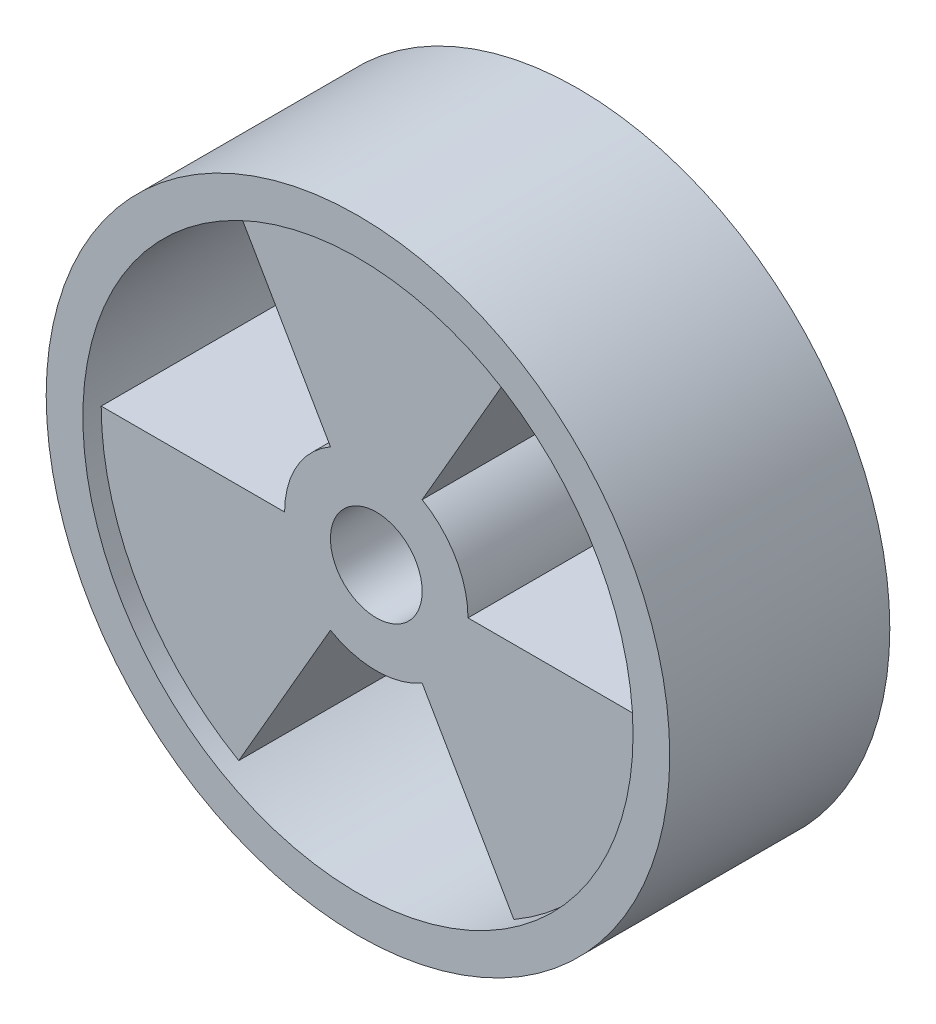
ISO-10303-21;
HEADER;
FILE_DESCRIPTION(('STEP AP214'),'2;1');
FILE_NAME('part.step','',(''),(''),'','','');
FILE_SCHEMA(('AUTOMOTIVE_DESIGN { 1 0 10303 214 1 1 1 1 }'));
ENDSEC;
DATA;
#1=APPLICATION_CONTEXT('core data for automotive mechanical design processes');
#2=APPLICATION_PROTOCOL_DEFINITION('international standard','automotive_design',2000,#1);
#3=PRODUCT_CONTEXT('',#1,'mechanical');
#4=PRODUCT('Part','Part','',(#3));
#5=PRODUCT_RELATED_PRODUCT_CATEGORY('part','',(#4));
#6=PRODUCT_DEFINITION_FORMATION('','',#4);
#7=PRODUCT_DEFINITION_CONTEXT('part definition',#1,'design');
#8=PRODUCT_DEFINITION('design','',#6,#7);
#9=PRODUCT_DEFINITION_SHAPE('','',#8);
#10=(LENGTH_UNIT() NAMED_UNIT(*) SI_UNIT(.MILLI.,.METRE.));
#11=(NAMED_UNIT(*) PLANE_ANGLE_UNIT() SI_UNIT($,.RADIAN.));
#12=(NAMED_UNIT(*) SI_UNIT($,.STERADIAN.) SOLID_ANGLE_UNIT());
#13=UNCERTAINTY_MEASURE_WITH_UNIT(LENGTH_MEASURE(1.E-05),#10,'distance_accuracy_value','');
#14=(GEOMETRIC_REPRESENTATION_CONTEXT(3) GLOBAL_UNCERTAINTY_ASSIGNED_CONTEXT((#13)) GLOBAL_UNIT_ASSIGNED_CONTEXT((#10,
#11,#12)) REPRESENTATION_CONTEXT('',''));
#15=CARTESIAN_POINT('',(0.,0.,0.));
#16=DIRECTION('',(0.,0.,1.));
#17=DIRECTION('',(1.,0.,0.));
#18=AXIS2_PLACEMENT_3D('',#15,#16,#17);
#19=CARTESIAN_POINT('',(0.,0.,10.));
#20=DIRECTION('',(0.,0.,1.));
#21=DIRECTION('',(1.,0.,0.));
#22=AXIS2_PLACEMENT_3D('',#19,#20,#21);
#23=PLANE('',#22);
#24=CARTESIAN_POINT('',(0.,0.,10.));
#25=DIRECTION('',(0.,0.,1.));
#26=DIRECTION('',(1.,0.,0.));
#27=AXIS2_PLACEMENT_3D('',#24,#25,#26);
#28=CIRCLE('',#27,2.5);
#29=CARTESIAN_POINT('',(2.5,0.,10.));
#30=VERTEX_POINT('',#29);
#31=EDGE_CURVE('E393',#30,#30,#28,.T.);
#32=ORIENTED_EDGE('',*,*,#31,.F.);
#33=EDGE_LOOP('',(#32));
#34=FACE_BOUND('',#33,.T.);
#35=DIRECTION('',(0.5,0.866025403784439,0.));
#36=VECTOR('',#35,1.);
#37=CARTESIAN_POINT('',(0.,0.,10.));
#38=LINE('',#37,#36);
#39=CARTESIAN_POINT('',(2.5,4.33012701892219,10.));
#40=VERTEX_POINT('',#39);
#41=CARTESIAN_POINT('',(7.5,12.9903810567666,10.));
#42=VERTEX_POINT('',#41);
#43=EDGE_CURVE('E11',#40,#42,#38,.T.);
#44=ORIENTED_EDGE('',*,*,#43,.T.);
#45=CARTESIAN_POINT('',(0.,0.,10.));
#46=DIRECTION('',(0.,0.,1.));
#47=DIRECTION('',(1.,0.,0.));
#48=AXIS2_PLACEMENT_3D('',#45,#46,#47);
#49=CIRCLE('',#48,15.);
#50=CARTESIAN_POINT('',(-7.50000000000003,12.9903810567666,10.));
#51=VERTEX_POINT('',#50);
#52=EDGE_CURVE('E146',#42,#51,#49,.T.);
#53=ORIENTED_EDGE('',*,*,#52,.T.);
#54=DIRECTION('',(-0.500000000000002,0.866025403784437,0.));
#55=VECTOR('',#54,1.);
#56=CARTESIAN_POINT('',(0.,0.,10.));
#57=LINE('',#56,#55);
#58=CARTESIAN_POINT('',(-2.50000000000001,4.33012701892219,10.));
#59=VERTEX_POINT('',#58);
#60=EDGE_CURVE('E221',#59,#51,#57,.T.);
#61=ORIENTED_EDGE('',*,*,#60,.F.);
#62=CARTESIAN_POINT('',(0.,0.,10.));
#63=DIRECTION('',(0.,0.,1.));
#64=DIRECTION('',(1.,0.,0.));
#65=AXIS2_PLACEMENT_3D('',#62,#63,#64);
#66=CIRCLE('',#65,5.);
#67=CARTESIAN_POINT('',(-5.,0.,10.));
#68=VERTEX_POINT('',#67);
#69=EDGE_CURVE('E158',#59,#68,#66,.T.);
#70=ORIENTED_EDGE('',*,*,#69,.T.);
#71=DIRECTION('',(-1.,0.,0.));
#72=VECTOR('',#71,1.);
#73=CARTESIAN_POINT('',(0.,0.,10.));
#74=LINE('',#73,#72);
#75=CARTESIAN_POINT('',(-15.,0.,10.));
#76=VERTEX_POINT('',#75);
#77=EDGE_CURVE('E150',#68,#76,#74,.T.);
#78=ORIENTED_EDGE('',*,*,#77,.T.);
#79=CARTESIAN_POINT('',(-7.49999999999996,-12.9903810567666,10.));
#80=VERTEX_POINT('',#79);
#81=EDGE_CURVE('E131',#76,#80,#49,.T.);
#82=ORIENTED_EDGE('',*,*,#81,.T.);
#83=DIRECTION('',(-0.499999999999998,-0.86602540378444,0.));
#84=VECTOR('',#83,1.);
#85=CARTESIAN_POINT('',(0.,0.,10.));
#86=LINE('',#85,#84);
#87=CARTESIAN_POINT('',(-2.49999999999999,-4.3301270189222,10.));
#88=VERTEX_POINT('',#87);
#89=EDGE_CURVE('E159',#88,#80,#86,.T.);
#90=ORIENTED_EDGE('',*,*,#89,.F.);
#91=CARTESIAN_POINT('',(0.,0.,10.));
#92=DIRECTION('',(0.,0.,1.));
#93=DIRECTION('',(1.,0.,0.));
#94=AXIS2_PLACEMENT_3D('',#91,#92,#93);
#95=CIRCLE('',#94,5.);
#96=CARTESIAN_POINT('',(2.5,-4.33012701892219,10.));
#97=VERTEX_POINT('',#96);
#98=EDGE_CURVE('E162',#88,#97,#95,.T.);
#99=ORIENTED_EDGE('',*,*,#98,.T.);
#100=DIRECTION('',(0.5,-0.866025403784438,0.));
#101=VECTOR('',#100,1.);
#102=CARTESIAN_POINT('',(0.,0.,10.));
#103=LINE('',#102,#101);
#104=CARTESIAN_POINT('',(7.50000000000001,-12.9903810567666,10.));
#105=VERTEX_POINT('',#104);
#106=EDGE_CURVE('E171',#97,#105,#103,.T.);
#107=ORIENTED_EDGE('',*,*,#106,.T.);
#108=CARTESIAN_POINT('',(15.,0.,10.));
#109=VERTEX_POINT('',#108);
#110=EDGE_CURVE('E147',#105,#109,#49,.T.);
#111=ORIENTED_EDGE('',*,*,#110,.T.);
#112=DIRECTION('',(1.,0.,0.));
#113=VECTOR('',#112,1.);
#114=CARTESIAN_POINT('',(0.,0.,10.));
#115=LINE('',#114,#113);
#116=CARTESIAN_POINT('',(5.,0.,10.));
#117=VERTEX_POINT('',#116);
#118=EDGE_CURVE('E167',#117,#109,#115,.T.);
#119=ORIENTED_EDGE('',*,*,#118,.F.);
#120=CARTESIAN_POINT('',(0.,0.,10.));
#121=DIRECTION('',(0.,0.,1.));
#122=DIRECTION('',(1.,0.,0.));
#123=AXIS2_PLACEMENT_3D('',#120,#121,#122);
#124=CIRCLE('',#123,5.);
#125=EDGE_CURVE('E170',#117,#40,#124,.T.);
#126=ORIENTED_EDGE('',*,*,#125,.T.);
#127=EDGE_LOOP('',(#44,#53,#61,#70,#78,#82,#90,#99,#107,#111,#119,#126));
#128=FACE_BOUND('',#127,.T.);
#129=ADVANCED_FACE('F40',(#34,#128),#23,.T.);
#130=CARTESIAN_POINT('',(0.,0.,0.));
#131=DIRECTION('',(0.,0.,1.));
#132=DIRECTION('',(1.,0.,0.));
#133=AXIS2_PLACEMENT_3D('',#130,#131,#132);
#134=PLANE('',#133);
#135=CARTESIAN_POINT('',(0.,0.,0.));
#136=DIRECTION('',(0.,0.,1.));
#137=DIRECTION('',(1.,0.,0.));
#138=AXIS2_PLACEMENT_3D('',#135,#136,#137);
#139=CIRCLE('',#138,2.5);
#140=CARTESIAN_POINT('',(2.5,0.,0.));
#141=VERTEX_POINT('',#140);
#142=EDGE_CURVE('E396',#141,#141,#139,.T.);
#143=ORIENTED_EDGE('',*,*,#142,.T.);
#144=EDGE_LOOP('',(#143));
#145=FACE_BOUND('',#144,.T.);
#146=CARTESIAN_POINT('',(0.,0.,0.));
#147=DIRECTION('',(0.,0.,1.));
#148=DIRECTION('',(1.,0.,0.));
#149=AXIS2_PLACEMENT_3D('',#146,#147,#148);
#150=CIRCLE('',#149,15.);
#151=CARTESIAN_POINT('',(7.5,12.9903810567666,0.));
#152=VERTEX_POINT('',#151);
#153=CARTESIAN_POINT('',(-7.50000000000003,12.9903810567666,0.));
#154=VERTEX_POINT('',#153);
#155=EDGE_CURVE('E205',#152,#154,#150,.T.);
#156=ORIENTED_EDGE('',*,*,#155,.F.);
#157=DIRECTION('',(0.5,0.866025403784439,0.));
#158=VECTOR('',#157,1.);
#159=CARTESIAN_POINT('',(0.,0.,0.));
#160=LINE('',#159,#158);
#161=CARTESIAN_POINT('',(2.5,4.33012701892219,0.));
#162=VERTEX_POINT('',#161);
#163=EDGE_CURVE('E178',#162,#152,#160,.T.);
#164=ORIENTED_EDGE('',*,*,#163,.F.);
#165=CARTESIAN_POINT('',(0.,0.,0.));
#166=DIRECTION('',(0.,0.,1.));
#167=DIRECTION('',(1.,0.,0.));
#168=AXIS2_PLACEMENT_3D('',#165,#166,#167);
#169=CIRCLE('',#168,5.);
#170=CARTESIAN_POINT('',(5.,0.,0.));
#171=VERTEX_POINT('',#170);
#172=EDGE_CURVE('E174',#171,#162,#169,.T.);
#173=ORIENTED_EDGE('',*,*,#172,.F.);
#174=DIRECTION('',(1.,0.,0.));
#175=VECTOR('',#174,1.);
#176=CARTESIAN_POINT('',(0.,0.,0.));
#177=LINE('',#176,#175);
#178=CARTESIAN_POINT('',(15.,0.,0.));
#179=VERTEX_POINT('',#178);
#180=EDGE_CURVE('E176',#171,#179,#177,.T.);
#181=ORIENTED_EDGE('',*,*,#180,.T.);
#182=CARTESIAN_POINT('',(7.5,-12.9903810567666,0.));
#183=VERTEX_POINT('',#182);
#184=EDGE_CURVE('E143',#183,#179,#150,.T.);
#185=ORIENTED_EDGE('',*,*,#184,.F.);
#186=DIRECTION('',(0.5,-0.866025403784438,0.));
#187=VECTOR('',#186,1.);
#188=CARTESIAN_POINT('',(0.,0.,0.));
#189=LINE('',#188,#187);
#190=CARTESIAN_POINT('',(2.5,-4.33012701892219,0.));
#191=VERTEX_POINT('',#190);
#192=EDGE_CURVE('E231',#191,#183,#189,.T.);
#193=ORIENTED_EDGE('',*,*,#192,.F.);
#194=CARTESIAN_POINT('',(0.,0.,0.));
#195=DIRECTION('',(0.,0.,1.));
#196=DIRECTION('',(1.,0.,0.));
#197=AXIS2_PLACEMENT_3D('',#194,#195,#196);
#198=CIRCLE('',#197,5.);
#199=CARTESIAN_POINT('',(-2.49999999999999,-4.3301270189222,0.));
#200=VERTEX_POINT('',#199);
#201=EDGE_CURVE('E63',#200,#191,#198,.T.);
#202=ORIENTED_EDGE('',*,*,#201,.F.);
#203=DIRECTION('',(-0.499999999999998,-0.86602540378444,0.));
#204=VECTOR('',#203,1.);
#205=CARTESIAN_POINT('',(0.,0.,0.));
#206=LINE('',#205,#204);
#207=CARTESIAN_POINT('',(-7.49999999999996,-12.9903810567666,0.));
#208=VERTEX_POINT('',#207);
#209=EDGE_CURVE('E228',#200,#208,#206,.T.);
#210=ORIENTED_EDGE('',*,*,#209,.T.);
#211=CARTESIAN_POINT('',(-15.,0.,0.));
#212=VERTEX_POINT('',#211);
#213=EDGE_CURVE('E144',#212,#208,#150,.T.);
#214=ORIENTED_EDGE('',*,*,#213,.F.);
#215=DIRECTION('',(-1.,0.,0.));
#216=VECTOR('',#215,1.);
#217=CARTESIAN_POINT('',(0.,0.,0.));
#218=LINE('',#217,#216);
#219=CARTESIAN_POINT('',(-5.,0.,0.));
#220=VERTEX_POINT('',#219);
#221=EDGE_CURVE('E152',#220,#212,#218,.T.);
#222=ORIENTED_EDGE('',*,*,#221,.F.);
#223=CARTESIAN_POINT('',(0.,0.,0.));
#224=DIRECTION('',(0.,0.,1.));
#225=DIRECTION('',(1.,0.,0.));
#226=AXIS2_PLACEMENT_3D('',#223,#224,#225);
#227=CIRCLE('',#226,5.);
#228=CARTESIAN_POINT('',(-2.50000000000001,4.33012701892219,0.));
#229=VERTEX_POINT('',#228);
#230=EDGE_CURVE('E55',#229,#220,#227,.T.);
#231=ORIENTED_EDGE('',*,*,#230,.F.);
#232=DIRECTION('',(-0.500000000000002,0.866025403784438,0.));
#233=VECTOR('',#232,1.);
#234=CARTESIAN_POINT('',(0.,0.,0.));
#235=LINE('',#234,#233);
#236=EDGE_CURVE('E242',#229,#154,#235,.T.);
#237=ORIENTED_EDGE('',*,*,#236,.T.);
#238=EDGE_LOOP('',(#156,#164,#173,#181,#185,#193,#202,#210,#214,#222,#231,#237));
#239=FACE_BOUND('',#238,.T.);
#240=ADVANCED_FACE('F202',(#145,#239),#134,.F.);
#241=CARTESIAN_POINT('',(0.,0.,10.001));
#242=DIRECTION('',(0.,0.,-1.));
#243=DIRECTION('',(-1.,0.,0.));
#244=AXIS2_PLACEMENT_3D('',#241,#242,#243);
#245=CYLINDRICAL_SURFACE('',#244,5.);
#246=DIRECTION('',(0.,0.,-1.));
#247=VECTOR('',#246,1.);
#248=CARTESIAN_POINT('',(5.,0.,10.001));
#249=LINE('',#248,#247);
#250=EDGE_CURVE('E48',#117,#171,#249,.T.);
#251=ORIENTED_EDGE('',*,*,#250,.T.);
#252=ORIENTED_EDGE('',*,*,#172,.T.);
#253=DIRECTION('',(0.,0.,-1.));
#254=VECTOR('',#253,1.);
#255=CARTESIAN_POINT('',(2.5,4.33012701892219,10.001));
#256=LINE('',#255,#254);
#257=EDGE_CURVE('E181',#40,#162,#256,.T.);
#258=ORIENTED_EDGE('',*,*,#257,.F.);
#259=ORIENTED_EDGE('',*,*,#125,.F.);
#260=EDGE_LOOP('',(#251,#252,#258,#259));
#261=FACE_BOUND('',#260,.T.);
#262=ADVANCED_FACE('F192',(#261),#245,.T.);
#263=CARTESIAN_POINT('',(0.,0.,10.001));
#264=DIRECTION('',(0.,1.,0.));
#265=DIRECTION('',(-1.,0.,0.));
#266=AXIS2_PLACEMENT_3D('',#263,#264,#265);
#267=PLANE('',#266);
#268=ORIENTED_EDGE('',*,*,#118,.T.);
#269=DIRECTION('',(0.,0.,-1.));
#270=VECTOR('',#269,1.);
#271=CARTESIAN_POINT('',(15.,0.,10.001));
#272=LINE('',#271,#270);
#273=EDGE_CURVE('E187',#109,#179,#272,.T.);
#274=ORIENTED_EDGE('',*,*,#273,.T.);
#275=ORIENTED_EDGE('',*,*,#180,.F.);
#276=ORIENTED_EDGE('',*,*,#250,.F.);
#277=EDGE_LOOP('',(#268,#274,#275,#276));
#278=FACE_BOUND('',#277,.T.);
#279=ADVANCED_FACE('F197',(#278),#267,.T.);
#280=CARTESIAN_POINT('',(0.,0.,10.001));
#281=DIRECTION('',(-0.866025403784439,0.5,0.));
#282=DIRECTION('',(-0.5,-0.866025403784439,0.));
#283=AXIS2_PLACEMENT_3D('',#280,#281,#282);
#284=PLANE('',#283);
#285=ORIENTED_EDGE('',*,*,#257,.T.);
#286=ORIENTED_EDGE('',*,*,#163,.T.);
#287=DIRECTION('',(0.,0.,-1.));
#288=VECTOR('',#287,1.);
#289=CARTESIAN_POINT('',(7.5,12.9903810567666,10.001));
#290=LINE('',#289,#288);
#291=EDGE_CURVE('E184',#42,#152,#290,.T.);
#292=ORIENTED_EDGE('',*,*,#291,.F.);
#293=ORIENTED_EDGE('',*,*,#43,.F.);
#294=EDGE_LOOP('',(#285,#286,#292,#293));
#295=FACE_BOUND('',#294,.T.);
#296=ADVANCED_FACE('F208',(#295),#284,.F.);
#297=CARTESIAN_POINT('',(0.,0.,10.001));
#298=DIRECTION('',(0.,0.,-1.));
#299=DIRECTION('',(-1.,0.,0.));
#300=AXIS2_PLACEMENT_3D('',#297,#298,#299);
#301=CYLINDRICAL_SURFACE('',#300,5.);
#302=DIRECTION('',(0.,0.,-1.));
#303=VECTOR('',#302,1.);
#304=CARTESIAN_POINT('',(-2.49999999999999,-4.3301270189222,10.001));
#305=LINE('',#304,#303);
#306=EDGE_CURVE('E237',#88,#200,#305,.T.);
#307=ORIENTED_EDGE('',*,*,#306,.T.);
#308=ORIENTED_EDGE('',*,*,#201,.T.);
#309=DIRECTION('',(0.,0.,-1.));
#310=VECTOR('',#309,1.);
#311=CARTESIAN_POINT('',(2.5,-4.33012701892219,10.001));
#312=LINE('',#311,#310);
#313=EDGE_CURVE('E233',#97,#191,#312,.T.);
#314=ORIENTED_EDGE('',*,*,#313,.F.);
#315=ORIENTED_EDGE('',*,*,#98,.F.);
#316=EDGE_LOOP('',(#307,#308,#314,#315));
#317=FACE_BOUND('',#316,.T.);
#318=ADVANCED_FACE('F253',(#317),#301,.T.);
#319=CARTESIAN_POINT('',(0.,0.,10.001));
#320=DIRECTION('',(0.86602540378444,-0.499999999999998,0.));
#321=DIRECTION('',(0.499999999999998,0.86602540378444,0.));
#322=AXIS2_PLACEMENT_3D('',#319,#320,#321);
#323=PLANE('',#322);
#324=ORIENTED_EDGE('',*,*,#89,.T.);
#325=DIRECTION('',(0.,0.,-1.));
#326=VECTOR('',#325,1.);
#327=CARTESIAN_POINT('',(-7.49999999999996,-12.9903810567666,10.001));
#328=LINE('',#327,#326);
#329=EDGE_CURVE('E138',#80,#208,#328,.T.);
#330=ORIENTED_EDGE('',*,*,#329,.T.);
#331=ORIENTED_EDGE('',*,*,#209,.F.);
#332=ORIENTED_EDGE('',*,*,#306,.F.);
#333=EDGE_LOOP('',(#324,#330,#331,#332));
#334=FACE_BOUND('',#333,.T.);
#335=ADVANCED_FACE('F252',(#334),#323,.T.);
#336=CARTESIAN_POINT('',(0.,0.,10.001));
#337=DIRECTION('',(0.866025403784438,0.5,0.));
#338=DIRECTION('',(-0.5,0.866025403784438,0.));
#339=AXIS2_PLACEMENT_3D('',#336,#337,#338);
#340=PLANE('',#339);
#341=ORIENTED_EDGE('',*,*,#313,.T.);
#342=ORIENTED_EDGE('',*,*,#192,.T.);
#343=DIRECTION('',(0.,0.,-1.));
#344=VECTOR('',#343,1.);
#345=CARTESIAN_POINT('',(7.5,-12.9903810567666,10.001));
#346=LINE('',#345,#344);
#347=EDGE_CURVE('E213',#105,#183,#346,.T.);
#348=ORIENTED_EDGE('',*,*,#347,.F.);
#349=ORIENTED_EDGE('',*,*,#106,.F.);
#350=EDGE_LOOP('',(#341,#342,#348,#349));
#351=FACE_BOUND('',#350,.T.);
#352=ADVANCED_FACE('F255',(#351),#340,.F.);
#353=CARTESIAN_POINT('',(0.,0.,10.001));
#354=DIRECTION('',(0.,0.,-1.));
#355=DIRECTION('',(-1.,0.,0.));
#356=AXIS2_PLACEMENT_3D('',#353,#354,#355);
#357=CYLINDRICAL_SURFACE('',#356,5.);
#358=DIRECTION('',(0.,0.,-1.));
#359=VECTOR('',#358,1.);
#360=CARTESIAN_POINT('',(-2.50000000000001,4.33012701892219,10.001));
#361=LINE('',#360,#359);
#362=EDGE_CURVE('E160',#59,#229,#361,.T.);
#363=ORIENTED_EDGE('',*,*,#362,.T.);
#364=ORIENTED_EDGE('',*,*,#230,.T.);
#365=DIRECTION('',(0.,0.,-1.));
#366=VECTOR('',#365,1.);
#367=CARTESIAN_POINT('',(-5.,0.,10.001));
#368=LINE('',#367,#366);
#369=EDGE_CURVE('E154',#68,#220,#368,.T.);
#370=ORIENTED_EDGE('',*,*,#369,.F.);
#371=ORIENTED_EDGE('',*,*,#69,.F.);
#372=EDGE_LOOP('',(#363,#364,#370,#371));
#373=FACE_BOUND('',#372,.T.);
#374=ADVANCED_FACE('F257',(#373),#357,.T.);
#375=CARTESIAN_POINT('',(0.,0.,10.001));
#376=DIRECTION('',(-0.866025403784437,-0.500000000000002,0.));
#377=DIRECTION('',(0.500000000000002,-0.866025403784437,0.));
#378=AXIS2_PLACEMENT_3D('',#375,#376,#377);
#379=PLANE('',#378);
#380=ORIENTED_EDGE('',*,*,#60,.T.);
#381=DIRECTION('',(0.,0.,-1.));
#382=VECTOR('',#381,1.);
#383=CARTESIAN_POINT('',(-7.50000000000003,12.9903810567666,10.001));
#384=LINE('',#383,#382);
#385=EDGE_CURVE('E153',#51,#154,#384,.T.);
#386=ORIENTED_EDGE('',*,*,#385,.T.);
#387=ORIENTED_EDGE('',*,*,#236,.F.);
#388=ORIENTED_EDGE('',*,*,#362,.F.);
#389=EDGE_LOOP('',(#380,#386,#387,#388));
#390=FACE_BOUND('',#389,.T.);
#391=ADVANCED_FACE('F247',(#390),#379,.T.);
#392=CARTESIAN_POINT('',(0.,0.,10.001));
#393=DIRECTION('',(0.,0.,-1.));
#394=DIRECTION('',(-1.,0.,0.));
#395=AXIS2_PLACEMENT_3D('',#392,#393,#394);
#396=CYLINDRICAL_SURFACE('',#395,15.);
#397=ORIENTED_EDGE('',*,*,#52,.F.);
#398=ORIENTED_EDGE('',*,*,#291,.T.);
#399=ORIENTED_EDGE('',*,*,#155,.T.);
#400=ORIENTED_EDGE('',*,*,#385,.F.);
#401=EDGE_LOOP('',(#397,#398,#399,#400));
#402=FACE_BOUND('',#401,.T.);
#403=ORIENTED_EDGE('',*,*,#81,.F.);
#404=DIRECTION('',(0.,0.,-1.));
#405=VECTOR('',#404,1.);
#406=CARTESIAN_POINT('',(-15.,0.,10.001));
#407=LINE('',#406,#405);
#408=EDGE_CURVE('E136',#76,#212,#407,.T.);
#409=ORIENTED_EDGE('',*,*,#408,.T.);
#410=ORIENTED_EDGE('',*,*,#213,.T.);
#411=ORIENTED_EDGE('',*,*,#329,.F.);
#412=EDGE_LOOP('',(#403,#409,#410,#411));
#413=FACE_BOUND('',#412,.T.);
#414=ORIENTED_EDGE('',*,*,#273,.F.);
#415=ORIENTED_EDGE('',*,*,#110,.F.);
#416=ORIENTED_EDGE('',*,*,#347,.T.);
#417=ORIENTED_EDGE('',*,*,#184,.T.);
#418=EDGE_LOOP('',(#414,#415,#416,#417));
#419=FACE_BOUND('',#418,.T.);
#420=CARTESIAN_POINT('',(0.,0.,-1.));
#421=DIRECTION('',(0.,0.,1.));
#422=DIRECTION('',(1.,0.,0.));
#423=AXIS2_PLACEMENT_3D('',#420,#421,#422);
#424=CIRCLE('',#423,15.);
#425=CARTESIAN_POINT('',(15.,0.,-1.));
#426=VERTEX_POINT('',#425);
#427=EDGE_CURVE('E406',#426,#426,#424,.T.);
#428=ORIENTED_EDGE('',*,*,#427,.F.);
#429=EDGE_LOOP('',(#428));
#430=FACE_BOUND('',#429,.T.);
#431=CARTESIAN_POINT('',(0.,0.,11.));
#432=DIRECTION('',(0.,0.,1.));
#433=DIRECTION('',(1.,0.,0.));
#434=AXIS2_PLACEMENT_3D('',#431,#432,#433);
#435=CIRCLE('',#434,15.);
#436=CARTESIAN_POINT('',(15.,0.,11.));
#437=VERTEX_POINT('',#436);
#438=EDGE_CURVE('E398',#437,#437,#435,.T.);
#439=ORIENTED_EDGE('',*,*,#438,.T.);
#440=EDGE_LOOP('',(#439));
#441=FACE_BOUND('',#440,.T.);
#442=ADVANCED_FACE('F133',(#402,#413,#419,#430,#441),#396,.F.);
#443=CARTESIAN_POINT('',(0.,0.,10.001));
#444=DIRECTION('',(0.,-1.,0.));
#445=DIRECTION('',(1.,0.,0.));
#446=AXIS2_PLACEMENT_3D('',#443,#444,#445);
#447=PLANE('',#446);
#448=ORIENTED_EDGE('',*,*,#369,.T.);
#449=ORIENTED_EDGE('',*,*,#221,.T.);
#450=ORIENTED_EDGE('',*,*,#408,.F.);
#451=ORIENTED_EDGE('',*,*,#77,.F.);
#452=EDGE_LOOP('',(#448,#449,#450,#451));
#453=FACE_BOUND('',#452,.T.);
#454=ADVANCED_FACE('F149',(#453),#447,.F.);
#455=CARTESIAN_POINT('',(0.,0.,-1.));
#456=DIRECTION('',(0.,0.,1.));
#457=DIRECTION('',(1.,0.,0.));
#458=AXIS2_PLACEMENT_3D('',#455,#456,#457);
#459=PLANE('',#458);
#460=ORIENTED_EDGE('',*,*,#427,.T.);
#461=EDGE_LOOP('',(#460));
#462=FACE_BOUND('',#461,.T.);
#463=CARTESIAN_POINT('',(0.,0.,-1.));
#464=DIRECTION('',(0.,0.,1.));
#465=DIRECTION('',(1.,0.,0.));
#466=AXIS2_PLACEMENT_3D('',#463,#464,#465);
#467=CIRCLE('',#466,17.);
#468=CARTESIAN_POINT('',(17.,0.,-1.));
#469=VERTEX_POINT('',#468);
#470=EDGE_CURVE('E218',#469,#469,#467,.T.);
#471=ORIENTED_EDGE('',*,*,#470,.F.);
#472=EDGE_LOOP('',(#471));
#473=FACE_BOUND('',#472,.T.);
#474=ADVANCED_FACE('F287',(#462,#473),#459,.F.);
#475=CARTESIAN_POINT('',(0.,0.,11.));
#476=DIRECTION('',(0.,0.,1.));
#477=DIRECTION('',(1.,0.,0.));
#478=AXIS2_PLACEMENT_3D('',#475,#476,#477);
#479=PLANE('',#478);
#480=ORIENTED_EDGE('',*,*,#438,.F.);
#481=EDGE_LOOP('',(#480));
#482=FACE_BOUND('',#481,.T.);
#483=CARTESIAN_POINT('',(0.,0.,11.));
#484=DIRECTION('',(0.,0.,1.));
#485=DIRECTION('',(1.,0.,0.));
#486=AXIS2_PLACEMENT_3D('',#483,#484,#485);
#487=CIRCLE('',#486,17.);
#488=CARTESIAN_POINT('',(17.,0.,11.));
#489=VERTEX_POINT('',#488);
#490=EDGE_CURVE('E403',#489,#489,#487,.T.);
#491=ORIENTED_EDGE('',*,*,#490,.T.);
#492=EDGE_LOOP('',(#491));
#493=FACE_BOUND('',#492,.T.);
#494=ADVANCED_FACE('F341',(#482,#493),#479,.T.);
#495=CARTESIAN_POINT('',(0.,0.,10.));
#496=DIRECTION('',(0.,0.,-1.));
#497=DIRECTION('',(-1.,0.,0.));
#498=AXIS2_PLACEMENT_3D('',#495,#496,#497);
#499=CYLINDRICAL_SURFACE('',#498,17.);
#500=ORIENTED_EDGE('',*,*,#470,.T.);
#501=EDGE_LOOP('',(#500));
#502=FACE_BOUND('',#501,.T.);
#503=ORIENTED_EDGE('',*,*,#490,.F.);
#504=EDGE_LOOP('',(#503));
#505=FACE_BOUND('',#504,.T.);
#506=ADVANCED_FACE('F42',(#502,#505),#499,.T.);
#507=CARTESIAN_POINT('',(0.,0.,11.001));
#508=DIRECTION('',(0.,0.,-1.));
#509=DIRECTION('',(-1.,0.,0.));
#510=AXIS2_PLACEMENT_3D('',#507,#508,#509);
#511=CYLINDRICAL_SURFACE('',#510,2.5);
#512=ORIENTED_EDGE('',*,*,#31,.T.);
#513=EDGE_LOOP('',(#512));
#514=FACE_BOUND('',#513,.T.);
#515=ORIENTED_EDGE('',*,*,#142,.F.);
#516=EDGE_LOOP('',(#515));
#517=FACE_BOUND('',#516,.T.);
#518=ADVANCED_FACE('F361',(#514,#517),#511,.F.);
#519=CLOSED_SHELL('',(#129,#240,#262,#279,#296,#318,#335,#352,#374,#391,#442,#454,#474,#494,
#506,#518));
#520=MANIFOLD_SOLID_BREP('B2',#519);
#521=ADVANCED_BREP_SHAPE_REPRESENTATION('',(#18,#520),#14);
#522=SHAPE_DEFINITION_REPRESENTATION(#9,#521);
ENDSEC;
END-ISO-10303-21;
